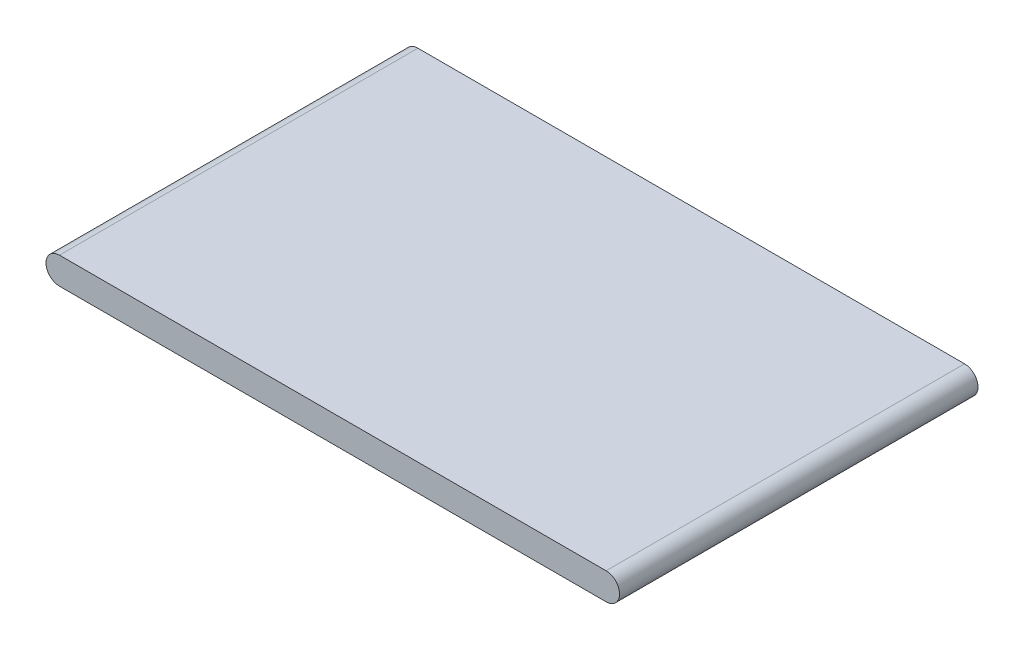
ISO-10303-21;
HEADER;
FILE_DESCRIPTION(('STEP AP214'),'2;1');
FILE_NAME('part.step','',(''),(''),'','','');
FILE_SCHEMA(('AUTOMOTIVE_DESIGN { 1 0 10303 214 1 1 1 1 }'));
ENDSEC;
DATA;
#1=APPLICATION_CONTEXT('core data for automotive mechanical design processes');
#2=APPLICATION_PROTOCOL_DEFINITION('international standard','automotive_design',2000,#1);
#3=PRODUCT_CONTEXT('',#1,'mechanical');
#4=PRODUCT('Part','Part','',(#3));
#5=PRODUCT_RELATED_PRODUCT_CATEGORY('part','',(#4));
#6=PRODUCT_DEFINITION_FORMATION('','',#4);
#7=PRODUCT_DEFINITION_CONTEXT('part definition',#1,'design');
#8=PRODUCT_DEFINITION('design','',#6,#7);
#9=PRODUCT_DEFINITION_SHAPE('','',#8);
#10=(LENGTH_UNIT() NAMED_UNIT(*) SI_UNIT(.MILLI.,.METRE.));
#11=(NAMED_UNIT(*) PLANE_ANGLE_UNIT() SI_UNIT($,.RADIAN.));
#12=(NAMED_UNIT(*) SI_UNIT($,.STERADIAN.) SOLID_ANGLE_UNIT());
#13=UNCERTAINTY_MEASURE_WITH_UNIT(LENGTH_MEASURE(1.E-05),#10,'distance_accuracy_value','');
#14=(GEOMETRIC_REPRESENTATION_CONTEXT(3) GLOBAL_UNCERTAINTY_ASSIGNED_CONTEXT((#13)) GLOBAL_UNIT_ASSIGNED_CONTEXT((#10,
#11,#12)) REPRESENTATION_CONTEXT('',''));
#15=CARTESIAN_POINT('',(0.,0.,0.));
#16=DIRECTION('',(0.,0.,1.));
#17=DIRECTION('',(1.,0.,0.));
#18=AXIS2_PLACEMENT_3D('',#15,#16,#17);
#19=CARTESIAN_POINT('',(0.,-3.,80.));
#20=DIRECTION('',(0.,0.,-1.));
#21=DIRECTION('',(-1.,0.,0.));
#22=AXIS2_PLACEMENT_3D('',#19,#20,#21);
#23=CYLINDRICAL_SURFACE('',#22,3.);
#24=CARTESIAN_POINT('',(0.,-3.,0.));
#25=DIRECTION('',(0.,0.,1.));
#26=DIRECTION('',(1.,0.,0.));
#27=AXIS2_PLACEMENT_3D('',#24,#25,#26);
#28=CIRCLE('',#27,3.);
#29=CARTESIAN_POINT('',(0.,0.,0.));
#30=VERTEX_POINT('',#29);
#31=CARTESIAN_POINT('',(0.,-6.,0.));
#32=VERTEX_POINT('',#31);
#33=EDGE_CURVE('E96',#30,#32,#28,.T.);
#34=ORIENTED_EDGE('',*,*,#33,.T.);
#35=DIRECTION('',(0.,0.,-1.));
#36=VECTOR('',#35,1.);
#37=CARTESIAN_POINT('',(0.,-6.,80.));
#38=LINE('',#37,#36);
#39=CARTESIAN_POINT('',(0.,-6.,80.));
#40=VERTEX_POINT('',#39);
#41=EDGE_CURVE('E11',#40,#32,#38,.T.);
#42=ORIENTED_EDGE('',*,*,#41,.F.);
#43=CARTESIAN_POINT('',(0.,-3.,80.));
#44=DIRECTION('',(0.,0.,1.));
#45=DIRECTION('',(1.,0.,0.));
#46=AXIS2_PLACEMENT_3D('',#43,#44,#45);
#47=CIRCLE('',#46,3.);
#48=CARTESIAN_POINT('',(0.,0.,80.));
#49=VERTEX_POINT('',#48);
#50=EDGE_CURVE('E84',#49,#40,#47,.T.);
#51=ORIENTED_EDGE('',*,*,#50,.F.);
#52=DIRECTION('',(0.,0.,-1.));
#53=VECTOR('',#52,1.);
#54=CARTESIAN_POINT('',(0.,0.,80.));
#55=LINE('',#54,#53);
#56=EDGE_CURVE('E92',#49,#30,#55,.T.);
#57=ORIENTED_EDGE('',*,*,#56,.T.);
#58=EDGE_LOOP('',(#34,#42,#51,#57));
#59=FACE_BOUND('',#58,.T.);
#60=ADVANCED_FACE('F33',(#59),#23,.T.);
#61=CARTESIAN_POINT('',(0.,-6.,80.));
#62=DIRECTION('',(0.,1.,0.));
#63=DIRECTION('',(-1.,0.,0.));
#64=AXIS2_PLACEMENT_3D('',#61,#62,#63);
#65=PLANE('',#64);
#66=DIRECTION('',(1.,0.,0.));
#67=VECTOR('',#66,1.);
#68=CARTESIAN_POINT('',(0.,-6.,0.));
#69=LINE('',#68,#67);
#70=CARTESIAN_POINT('',(122.,-6.,0.));
#71=VERTEX_POINT('',#70);
#72=EDGE_CURVE('E88',#32,#71,#69,.T.);
#73=ORIENTED_EDGE('',*,*,#72,.T.);
#74=DIRECTION('',(0.,0.,-1.));
#75=VECTOR('',#74,1.);
#76=CARTESIAN_POINT('',(122.,-6.,80.));
#77=LINE('',#76,#75);
#78=CARTESIAN_POINT('',(122.,-6.,80.));
#79=VERTEX_POINT('',#78);
#80=EDGE_CURVE('E41',#79,#71,#77,.T.);
#81=ORIENTED_EDGE('',*,*,#80,.F.);
#82=DIRECTION('',(1.,0.,0.));
#83=VECTOR('',#82,1.);
#84=CARTESIAN_POINT('',(0.,-6.,80.));
#85=LINE('',#84,#83);
#86=EDGE_CURVE('E79',#40,#79,#85,.T.);
#87=ORIENTED_EDGE('',*,*,#86,.F.);
#88=ORIENTED_EDGE('',*,*,#41,.T.);
#89=EDGE_LOOP('',(#73,#81,#87,#88));
#90=FACE_BOUND('',#89,.T.);
#91=ADVANCED_FACE('F87',(#90),#65,.F.);
#92=CARTESIAN_POINT('',(122.,-3.,80.));
#93=DIRECTION('',(0.,0.,-1.));
#94=DIRECTION('',(-1.,0.,0.));
#95=AXIS2_PLACEMENT_3D('',#92,#93,#94);
#96=CYLINDRICAL_SURFACE('',#95,3.);
#97=CARTESIAN_POINT('',(122.,-3.,0.));
#98=DIRECTION('',(0.,0.,1.));
#99=DIRECTION('',(1.,0.,0.));
#100=AXIS2_PLACEMENT_3D('',#97,#98,#99);
#101=CIRCLE('',#100,3.);
#102=CARTESIAN_POINT('',(122.,0.,0.));
#103=VERTEX_POINT('',#102);
#104=EDGE_CURVE('E66',#71,#103,#101,.T.);
#105=ORIENTED_EDGE('',*,*,#104,.T.);
#106=DIRECTION('',(0.,0.,-1.));
#107=VECTOR('',#106,1.);
#108=CARTESIAN_POINT('',(122.,0.,80.));
#109=LINE('',#108,#107);
#110=CARTESIAN_POINT('',(122.,0.,80.));
#111=VERTEX_POINT('',#110);
#112=EDGE_CURVE('E89',#111,#103,#109,.T.);
#113=ORIENTED_EDGE('',*,*,#112,.F.);
#114=CARTESIAN_POINT('',(122.,-3.,80.));
#115=DIRECTION('',(0.,0.,1.));
#116=DIRECTION('',(1.,0.,0.));
#117=AXIS2_PLACEMENT_3D('',#114,#115,#116);
#118=CIRCLE('',#117,3.);
#119=EDGE_CURVE('E82',#79,#111,#118,.T.);
#120=ORIENTED_EDGE('',*,*,#119,.F.);
#121=ORIENTED_EDGE('',*,*,#80,.T.);
#122=EDGE_LOOP('',(#105,#113,#120,#121));
#123=FACE_BOUND('',#122,.T.);
#124=ADVANCED_FACE('F90',(#123),#96,.T.);
#125=CARTESIAN_POINT('',(0.,0.,80.));
#126=DIRECTION('',(0.,-1.,0.));
#127=DIRECTION('',(0.,0.,-1.));
#128=AXIS2_PLACEMENT_3D('',#125,#126,#127);
#129=PLANE('',#128);
#130=DIRECTION('',(-1.,0.,0.));
#131=VECTOR('',#130,1.);
#132=CARTESIAN_POINT('',(0.,0.,0.));
#133=LINE('',#132,#131);
#134=EDGE_CURVE('E72',#103,#30,#133,.T.);
#135=ORIENTED_EDGE('',*,*,#134,.T.);
#136=ORIENTED_EDGE('',*,*,#56,.F.);
#137=DIRECTION('',(-1.,0.,0.));
#138=VECTOR('',#137,1.);
#139=CARTESIAN_POINT('',(0.,0.,80.));
#140=LINE('',#139,#138);
#141=EDGE_CURVE('E49',#111,#49,#140,.T.);
#142=ORIENTED_EDGE('',*,*,#141,.F.);
#143=ORIENTED_EDGE('',*,*,#112,.T.);
#144=EDGE_LOOP('',(#135,#136,#142,#143));
#145=FACE_BOUND('',#144,.T.);
#146=ADVANCED_FACE('F103',(#145),#129,.F.);
#147=CARTESIAN_POINT('',(0.,-3.,80.));
#148=DIRECTION('',(0.,0.,1.));
#149=DIRECTION('',(1.,0.,0.));
#150=AXIS2_PLACEMENT_3D('',#147,#148,#149);
#151=PLANE('',#150);
#152=ORIENTED_EDGE('',*,*,#50,.T.);
#153=ORIENTED_EDGE('',*,*,#86,.T.);
#154=ORIENTED_EDGE('',*,*,#119,.T.);
#155=ORIENTED_EDGE('',*,*,#141,.T.);
#156=EDGE_LOOP('',(#152,#153,#154,#155));
#157=FACE_BOUND('',#156,.T.);
#158=ADVANCED_FACE('F80',(#157),#151,.T.);
#159=CARTESIAN_POINT('',(0.,-3.,0.));
#160=DIRECTION('',(0.,0.,1.));
#161=DIRECTION('',(1.,0.,0.));
#162=AXIS2_PLACEMENT_3D('',#159,#160,#161);
#163=PLANE('',#162);
#164=ORIENTED_EDGE('',*,*,#33,.F.);
#165=ORIENTED_EDGE('',*,*,#134,.F.);
#166=ORIENTED_EDGE('',*,*,#104,.F.);
#167=ORIENTED_EDGE('',*,*,#72,.F.);
#168=EDGE_LOOP('',(#164,#165,#166,#167));
#169=FACE_BOUND('',#168,.T.);
#170=ADVANCED_FACE('F106',(#169),#163,.F.);
#171=CLOSED_SHELL('',(#60,#91,#124,#146,#158,#170));
#172=MANIFOLD_SOLID_BREP('B2',#171);
#173=ADVANCED_BREP_SHAPE_REPRESENTATION('',(#18,#172),#14);
#174=SHAPE_DEFINITION_REPRESENTATION(#9,#173);
ENDSEC;
END-ISO-10303-21;
